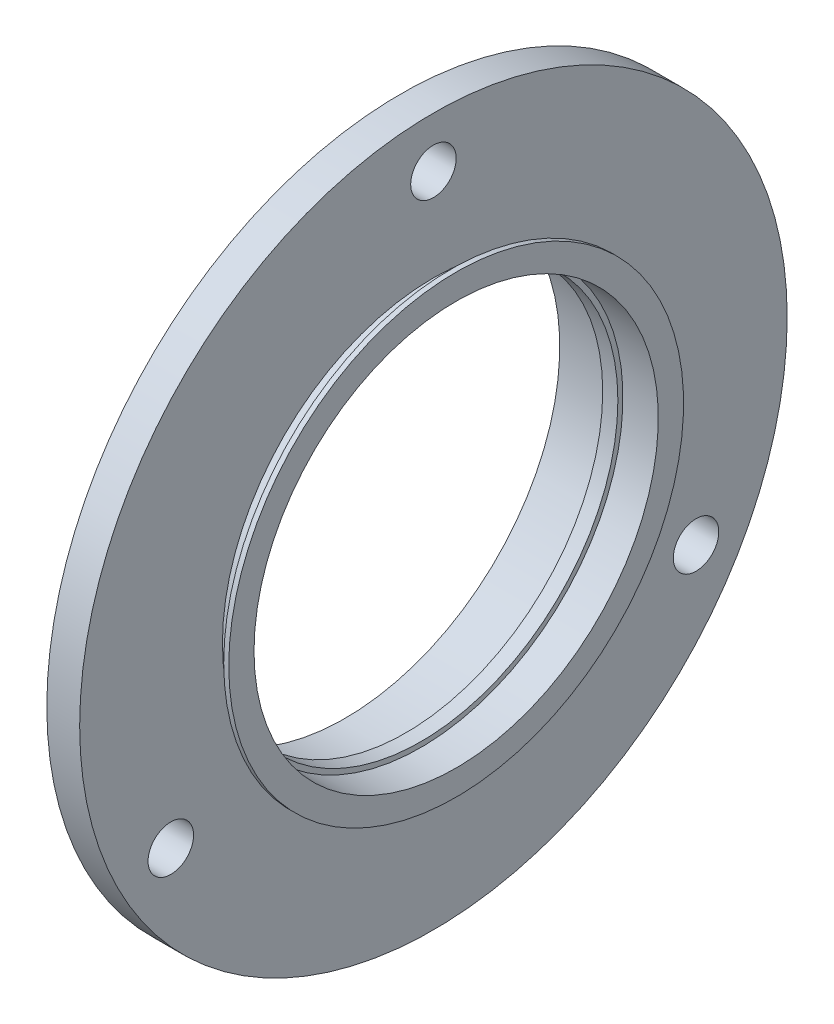
ISO-10303-21;
HEADER;
FILE_DESCRIPTION(('STEP AP214'),'2;1');
FILE_NAME('part.step','',(''),(''),'','','');
FILE_SCHEMA(('AUTOMOTIVE_DESIGN { 1 0 10303 214 1 1 1 1 }'));
ENDSEC;
DATA;
#1=APPLICATION_CONTEXT('core data for automotive mechanical design processes');
#2=APPLICATION_PROTOCOL_DEFINITION('international standard','automotive_design',2000,#1);
#3=PRODUCT_CONTEXT('',#1,'mechanical');
#4=PRODUCT('Part','Part','',(#3));
#5=PRODUCT_RELATED_PRODUCT_CATEGORY('part','',(#4));
#6=PRODUCT_DEFINITION_FORMATION('','',#4);
#7=PRODUCT_DEFINITION_CONTEXT('part definition',#1,'design');
#8=PRODUCT_DEFINITION('design','',#6,#7);
#9=PRODUCT_DEFINITION_SHAPE('','',#8);
#10=(LENGTH_UNIT() NAMED_UNIT(*) SI_UNIT(.MILLI.,.METRE.));
#11=(NAMED_UNIT(*) PLANE_ANGLE_UNIT() SI_UNIT($,.RADIAN.));
#12=(NAMED_UNIT(*) SI_UNIT($,.STERADIAN.) SOLID_ANGLE_UNIT());
#13=UNCERTAINTY_MEASURE_WITH_UNIT(LENGTH_MEASURE(1.E-05),#10,'distance_accuracy_value','');
#14=(GEOMETRIC_REPRESENTATION_CONTEXT(3) GLOBAL_UNCERTAINTY_ASSIGNED_CONTEXT((#13)) GLOBAL_UNIT_ASSIGNED_CONTEXT((#10,
#11,#12)) REPRESENTATION_CONTEXT('',''));
#15=CARTESIAN_POINT('',(0.,0.,0.));
#16=DIRECTION('',(0.,0.,1.));
#17=DIRECTION('',(1.,0.,0.));
#18=AXIS2_PLACEMENT_3D('',#15,#16,#17);
#19=CARTESIAN_POINT('',(-54.5549392406658,0.,0.));
#20=DIRECTION('',(-1.,0.,0.));
#21=DIRECTION('',(0.,0.,1.));
#22=AXIS2_PLACEMENT_3D('',#19,#20,#21);
#23=CYLINDRICAL_SURFACE('',#22,40.);
#24=CARTESIAN_POINT('',(0.,0.,0.));
#25=DIRECTION('',(-1.,0.,0.));
#26=DIRECTION('',(0.,0.,1.));
#27=AXIS2_PLACEMENT_3D('',#24,#25,#26);
#28=CIRCLE('',#27,40.);
#29=CARTESIAN_POINT('',(0.,0.,40.));
#30=VERTEX_POINT('',#29);
#31=EDGE_CURVE('E10',#30,#30,#28,.T.);
#32=ORIENTED_EDGE('',*,*,#31,.F.);
#33=EDGE_LOOP('',(#32));
#34=FACE_BOUND('',#33,.T.);
#35=CARTESIAN_POINT('',(-7.00000000000001,0.,0.));
#36=DIRECTION('',(-1.,0.,0.));
#37=DIRECTION('',(0.,0.,1.));
#38=AXIS2_PLACEMENT_3D('',#35,#36,#37);
#39=CIRCLE('',#38,40.);
#40=CARTESIAN_POINT('',(-7.00000000000001,0.,40.));
#41=VERTEX_POINT('',#40);
#42=EDGE_CURVE('E77',#41,#41,#39,.T.);
#43=ORIENTED_EDGE('',*,*,#42,.T.);
#44=EDGE_LOOP('',(#43));
#45=FACE_BOUND('',#44,.T.);
#46=ADVANCED_FACE('F31',(#34,#45),#23,.F.);
#47=CARTESIAN_POINT('',(0.,40.,0.));
#48=DIRECTION('',(-1.,0.,0.));
#49=DIRECTION('',(0.,0.,1.));
#50=AXIS2_PLACEMENT_3D('',#47,#48,#49);
#51=PLANE('',#50);
#52=CARTESIAN_POINT('',(0.,0.,0.));
#53=DIRECTION('',(-1.,0.,0.));
#54=DIRECTION('',(0.,0.,1.));
#55=AXIS2_PLACEMENT_3D('',#52,#53,#54);
#56=CIRCLE('',#55,45.);
#57=CARTESIAN_POINT('',(0.,0.,45.));
#58=VERTEX_POINT('',#57);
#59=EDGE_CURVE('E37',#58,#58,#56,.T.);
#60=ORIENTED_EDGE('',*,*,#59,.F.);
#61=EDGE_LOOP('',(#60));
#62=FACE_BOUND('',#61,.T.);
#63=ORIENTED_EDGE('',*,*,#31,.T.);
#64=EDGE_LOOP('',(#63));
#65=FACE_BOUND('',#64,.T.);
#66=ADVANCED_FACE('F142',(#62,#65),#51,.F.);
#67=CARTESIAN_POINT('',(-54.5549392406658,0.,0.));
#68=DIRECTION('',(-1.,0.,0.));
#69=DIRECTION('',(0.,0.,1.));
#70=AXIS2_PLACEMENT_3D('',#67,#68,#69);
#71=CYLINDRICAL_SURFACE('',#70,45.);
#72=CARTESIAN_POINT('',(-1.,0.,0.));
#73=DIRECTION('',(-1.,0.,0.));
#74=DIRECTION('',(0.,0.,1.));
#75=AXIS2_PLACEMENT_3D('',#72,#73,#74);
#76=CIRCLE('',#75,45.);
#77=CARTESIAN_POINT('',(-1.,0.,45.));
#78=VERTEX_POINT('',#77);
#79=EDGE_CURVE('E41',#78,#78,#76,.T.);
#80=ORIENTED_EDGE('',*,*,#79,.F.);
#81=EDGE_LOOP('',(#80));
#82=FACE_BOUND('',#81,.T.);
#83=ORIENTED_EDGE('',*,*,#59,.T.);
#84=EDGE_LOOP('',(#83));
#85=FACE_BOUND('',#84,.T.);
#86=ADVANCED_FACE('F137',(#82,#85),#71,.T.);
#87=CARTESIAN_POINT('',(-1.,41.75,0.));
#88=DIRECTION('',(1.,0.,0.));
#89=DIRECTION('',(0.,0.,-1.));
#90=AXIS2_PLACEMENT_3D('',#87,#88,#89);
#91=PLANE('',#90);
#92=CARTESIAN_POINT('',(-1.,0.,0.));
#93=DIRECTION('',(-1.,0.,0.));
#94=DIRECTION('',(0.,0.,1.));
#95=AXIS2_PLACEMENT_3D('',#92,#93,#94);
#96=CIRCLE('',#95,41.75);
#97=CARTESIAN_POINT('',(-1.,0.,41.75));
#98=VERTEX_POINT('',#97);
#99=EDGE_CURVE('E45',#98,#98,#96,.T.);
#100=ORIENTED_EDGE('',*,*,#99,.F.);
#101=EDGE_LOOP('',(#100));
#102=FACE_BOUND('',#101,.T.);
#103=ORIENTED_EDGE('',*,*,#79,.T.);
#104=EDGE_LOOP('',(#103));
#105=FACE_BOUND('',#104,.T.);
#106=ADVANCED_FACE('F131',(#102,#105),#91,.F.);
#107=CARTESIAN_POINT('',(-54.5549392406658,0.,0.));
#108=DIRECTION('',(-1.,0.,0.));
#109=DIRECTION('',(0.,0.,1.));
#110=AXIS2_PLACEMENT_3D('',#107,#108,#109);
#111=CYLINDRICAL_SURFACE('',#110,41.75);
#112=CARTESIAN_POINT('',(-4.5,0.,0.));
#113=DIRECTION('',(-1.,0.,0.));
#114=DIRECTION('',(0.,0.,1.));
#115=AXIS2_PLACEMENT_3D('',#112,#113,#114);
#116=CIRCLE('',#115,41.75);
#117=CARTESIAN_POINT('',(-4.5,0.,41.75));
#118=VERTEX_POINT('',#117);
#119=EDGE_CURVE('E50',#118,#118,#116,.T.);
#120=ORIENTED_EDGE('',*,*,#119,.F.);
#121=EDGE_LOOP('',(#120));
#122=FACE_BOUND('',#121,.T.);
#123=ORIENTED_EDGE('',*,*,#99,.T.);
#124=EDGE_LOOP('',(#123));
#125=FACE_BOUND('',#124,.T.);
#126=ADVANCED_FACE('F124',(#122,#125),#111,.T.);
#127=CARTESIAN_POINT('',(-4.5,41.75,0.));
#128=DIRECTION('',(-1.,0.,0.));
#129=DIRECTION('',(0.,0.,1.));
#130=AXIS2_PLACEMENT_3D('',#127,#128,#129);
#131=PLANE('',#130);
#132=CARTESIAN_POINT('',(-4.5,60.,0.));
#133=DIRECTION('',(-1.,0.,0.));
#134=DIRECTION('',(0.,0.,1.));
#135=AXIS2_PLACEMENT_3D('',#132,#133,#134);
#136=CIRCLE('',#135,4.5);
#137=CARTESIAN_POINT('',(-4.5,60.,4.5));
#138=VERTEX_POINT('',#137);
#139=EDGE_CURVE('E80',#138,#138,#136,.T.);
#140=ORIENTED_EDGE('',*,*,#139,.T.);
#141=EDGE_LOOP('',(#140));
#142=FACE_BOUND('',#141,.T.);
#143=CARTESIAN_POINT('',(-4.5,-29.9999999999982,51.9615242270695));
#144=DIRECTION('',(-1.,0.,0.));
#145=DIRECTION('',(0.,0.,1.));
#146=AXIS2_PLACEMENT_3D('',#143,#144,#145);
#147=CIRCLE('',#146,4.5);
#148=CARTESIAN_POINT('',(-4.5,-29.9999999999982,56.4615242270695));
#149=VERTEX_POINT('',#148);
#150=EDGE_CURVE('E83',#149,#149,#147,.T.);
#151=ORIENTED_EDGE('',*,*,#150,.T.);
#152=EDGE_LOOP('',(#151));
#153=FACE_BOUND('',#152,.T.);
#154=CARTESIAN_POINT('',(-4.5,-30.0000000000019,-51.9615242270631));
#155=DIRECTION('',(-1.,0.,0.));
#156=DIRECTION('',(0.,0.,1.));
#157=AXIS2_PLACEMENT_3D('',#154,#155,#156);
#158=CIRCLE('',#157,4.5);
#159=CARTESIAN_POINT('',(-4.5,-30.0000000000019,-47.4615242270631));
#160=VERTEX_POINT('',#159);
#161=EDGE_CURVE('E86',#160,#160,#158,.T.);
#162=ORIENTED_EDGE('',*,*,#161,.T.);
#163=EDGE_LOOP('',(#162));
#164=FACE_BOUND('',#163,.T.);
#165=CARTESIAN_POINT('',(-4.5,0.,0.));
#166=DIRECTION('',(-1.,0.,0.));
#167=DIRECTION('',(0.,0.,1.));
#168=AXIS2_PLACEMENT_3D('',#165,#166,#167);
#169=CIRCLE('',#168,70.);
#170=CARTESIAN_POINT('',(-4.5,0.,70.));
#171=VERTEX_POINT('',#170);
#172=EDGE_CURVE('E53',#171,#171,#169,.T.);
#173=ORIENTED_EDGE('',*,*,#172,.F.);
#174=EDGE_LOOP('',(#173));
#175=FACE_BOUND('',#174,.T.);
#176=ORIENTED_EDGE('',*,*,#119,.T.);
#177=EDGE_LOOP('',(#176));
#178=FACE_BOUND('',#177,.T.);
#179=ADVANCED_FACE('F118',(#142,#153,#164,#175,#178),#131,.F.);
#180=CARTESIAN_POINT('',(-54.5549392406658,0.,0.));
#181=DIRECTION('',(-1.,0.,0.));
#182=DIRECTION('',(0.,0.,1.));
#183=AXIS2_PLACEMENT_3D('',#180,#181,#182);
#184=CYLINDRICAL_SURFACE('',#183,70.);
#185=CARTESIAN_POINT('',(-11.,0.,0.));
#186=DIRECTION('',(-1.,0.,0.));
#187=DIRECTION('',(0.,0.,1.));
#188=AXIS2_PLACEMENT_3D('',#185,#186,#187);
#189=CIRCLE('',#188,70.);
#190=CARTESIAN_POINT('',(-11.,0.,70.));
#191=VERTEX_POINT('',#190);
#192=EDGE_CURVE('E56',#191,#191,#189,.T.);
#193=ORIENTED_EDGE('',*,*,#192,.F.);
#194=EDGE_LOOP('',(#193));
#195=FACE_BOUND('',#194,.T.);
#196=ORIENTED_EDGE('',*,*,#172,.T.);
#197=EDGE_LOOP('',(#196));
#198=FACE_BOUND('',#197,.T.);
#199=ADVANCED_FACE('F106',(#195,#198),#184,.T.);
#200=CARTESIAN_POINT('',(-11.,70.,0.));
#201=DIRECTION('',(1.,0.,0.));
#202=DIRECTION('',(0.,0.,-1.));
#203=AXIS2_PLACEMENT_3D('',#200,#201,#202);
#204=PLANE('',#203);
#205=CARTESIAN_POINT('',(-11.,60.,0.));
#206=DIRECTION('',(-1.,0.,0.));
#207=DIRECTION('',(0.,0.,1.));
#208=AXIS2_PLACEMENT_3D('',#205,#206,#207);
#209=CIRCLE('',#208,4.5);
#210=CARTESIAN_POINT('',(-11.,60.,4.5));
#211=VERTEX_POINT('',#210);
#212=EDGE_CURVE('E89',#211,#211,#209,.T.);
#213=ORIENTED_EDGE('',*,*,#212,.F.);
#214=EDGE_LOOP('',(#213));
#215=FACE_BOUND('',#214,.T.);
#216=CARTESIAN_POINT('',(-11.,-29.9999999999982,51.9615242270695));
#217=DIRECTION('',(-1.,0.,0.));
#218=DIRECTION('',(0.,0.,1.));
#219=AXIS2_PLACEMENT_3D('',#216,#217,#218);
#220=CIRCLE('',#219,4.5);
#221=CARTESIAN_POINT('',(-11.,-29.9999999999982,56.4615242270695));
#222=VERTEX_POINT('',#221);
#223=EDGE_CURVE('E93',#222,#222,#220,.T.);
#224=ORIENTED_EDGE('',*,*,#223,.F.);
#225=EDGE_LOOP('',(#224));
#226=FACE_BOUND('',#225,.T.);
#227=CARTESIAN_POINT('',(-11.,-30.0000000000019,-51.9615242270631));
#228=DIRECTION('',(-1.,0.,0.));
#229=DIRECTION('',(0.,0.,1.));
#230=AXIS2_PLACEMENT_3D('',#227,#228,#229);
#231=CIRCLE('',#230,4.5);
#232=CARTESIAN_POINT('',(-11.,-30.0000000000019,-47.4615242270631));
#233=VERTEX_POINT('',#232);
#234=EDGE_CURVE('E90',#233,#233,#231,.T.);
#235=ORIENTED_EDGE('',*,*,#234,.F.);
#236=EDGE_LOOP('',(#235));
#237=FACE_BOUND('',#236,.T.);
#238=CARTESIAN_POINT('',(-11.,0.,0.));
#239=DIRECTION('',(-1.,0.,0.));
#240=DIRECTION('',(0.,0.,1.));
#241=AXIS2_PLACEMENT_3D('',#238,#239,#240);
#242=CIRCLE('',#241,47.5);
#243=CARTESIAN_POINT('',(-11.,0.,47.5));
#244=VERTEX_POINT('',#243);
#245=EDGE_CURVE('E59',#244,#244,#242,.T.);
#246=ORIENTED_EDGE('',*,*,#245,.F.);
#247=EDGE_LOOP('',(#246));
#248=FACE_BOUND('',#247,.T.);
#249=ORIENTED_EDGE('',*,*,#192,.T.);
#250=EDGE_LOOP('',(#249));
#251=FACE_BOUND('',#250,.T.);
#252=ADVANCED_FACE('F102',(#215,#226,#237,#248,#251),#204,.F.);
#253=CARTESIAN_POINT('',(-54.5549392406658,0.,0.));
#254=DIRECTION('',(-1.,0.,0.));
#255=DIRECTION('',(0.,0.,1.));
#256=AXIS2_PLACEMENT_3D('',#253,#254,#255);
#257=CYLINDRICAL_SURFACE('',#256,47.5);
#258=CARTESIAN_POINT('',(-22.,0.,0.));
#259=DIRECTION('',(-1.,0.,0.));
#260=DIRECTION('',(0.,0.,1.));
#261=AXIS2_PLACEMENT_3D('',#258,#259,#260);
#262=CIRCLE('',#261,47.5);
#263=CARTESIAN_POINT('',(-22.,0.,47.5));
#264=VERTEX_POINT('',#263);
#265=EDGE_CURVE('E62',#264,#264,#262,.T.);
#266=ORIENTED_EDGE('',*,*,#265,.F.);
#267=EDGE_LOOP('',(#266));
#268=FACE_BOUND('',#267,.T.);
#269=ORIENTED_EDGE('',*,*,#245,.T.);
#270=EDGE_LOOP('',(#269));
#271=FACE_BOUND('',#270,.T.);
#272=ADVANCED_FACE('F105',(#268,#271),#257,.T.);
#273=CARTESIAN_POINT('',(-22.,47.5,0.));
#274=DIRECTION('',(1.,0.,0.));
#275=DIRECTION('',(0.,0.,-1.));
#276=AXIS2_PLACEMENT_3D('',#273,#274,#275);
#277=PLANE('',#276);
#278=CARTESIAN_POINT('',(-22.,0.,0.));
#279=DIRECTION('',(-1.,0.,0.));
#280=DIRECTION('',(0.,0.,1.));
#281=AXIS2_PLACEMENT_3D('',#278,#279,#280);
#282=CIRCLE('',#281,42.5);
#283=CARTESIAN_POINT('',(-22.,0.,42.5));
#284=VERTEX_POINT('',#283);
#285=EDGE_CURVE('E65',#284,#284,#282,.T.);
#286=ORIENTED_EDGE('',*,*,#285,.F.);
#287=EDGE_LOOP('',(#286));
#288=FACE_BOUND('',#287,.T.);
#289=ORIENTED_EDGE('',*,*,#265,.T.);
#290=EDGE_LOOP('',(#289));
#291=FACE_BOUND('',#290,.T.);
#292=ADVANCED_FACE('F177',(#288,#291),#277,.F.);
#293=CARTESIAN_POINT('',(-54.5549392406658,0.,0.));
#294=DIRECTION('',(-1.,0.,0.));
#295=DIRECTION('',(0.,0.,1.));
#296=AXIS2_PLACEMENT_3D('',#293,#294,#295);
#297=CYLINDRICAL_SURFACE('',#296,42.5);
#298=CARTESIAN_POINT('',(-10.,0.,0.));
#299=DIRECTION('',(-1.,0.,0.));
#300=DIRECTION('',(0.,0.,1.));
#301=AXIS2_PLACEMENT_3D('',#298,#299,#300);
#302=CIRCLE('',#301,42.5);
#303=CARTESIAN_POINT('',(-10.,0.,42.5));
#304=VERTEX_POINT('',#303);
#305=EDGE_CURVE('E68',#304,#304,#302,.T.);
#306=ORIENTED_EDGE('',*,*,#305,.F.);
#307=EDGE_LOOP('',(#306));
#308=FACE_BOUND('',#307,.T.);
#309=ORIENTED_EDGE('',*,*,#285,.T.);
#310=EDGE_LOOP('',(#309));
#311=FACE_BOUND('',#310,.T.);
#312=ADVANCED_FACE('F171',(#308,#311),#297,.F.);
#313=CARTESIAN_POINT('',(-10.,42.5,0.));
#314=DIRECTION('',(1.,0.,0.));
#315=DIRECTION('',(0.,0.,-1.));
#316=AXIS2_PLACEMENT_3D('',#313,#314,#315);
#317=PLANE('',#316);
#318=CARTESIAN_POINT('',(-10.,0.,0.));
#319=DIRECTION('',(-1.,0.,0.));
#320=DIRECTION('',(0.,0.,1.));
#321=AXIS2_PLACEMENT_3D('',#318,#319,#320);
#322=CIRCLE('',#321,39.);
#323=CARTESIAN_POINT('',(-10.,0.,39.));
#324=VERTEX_POINT('',#323);
#325=EDGE_CURVE('E71',#324,#324,#322,.T.);
#326=ORIENTED_EDGE('',*,*,#325,.F.);
#327=EDGE_LOOP('',(#326));
#328=FACE_BOUND('',#327,.T.);
#329=ORIENTED_EDGE('',*,*,#305,.T.);
#330=EDGE_LOOP('',(#329));
#331=FACE_BOUND('',#330,.T.);
#332=ADVANCED_FACE('F165',(#328,#331),#317,.F.);
#333=CARTESIAN_POINT('',(-54.5549392406658,0.,0.));
#334=DIRECTION('',(-1.,0.,0.));
#335=DIRECTION('',(0.,0.,1.));
#336=AXIS2_PLACEMENT_3D('',#333,#334,#335);
#337=CYLINDRICAL_SURFACE('',#336,39.);
#338=CARTESIAN_POINT('',(-7.00000000000001,0.,0.));
#339=DIRECTION('',(-1.,0.,0.));
#340=DIRECTION('',(0.,0.,1.));
#341=AXIS2_PLACEMENT_3D('',#338,#339,#340);
#342=CIRCLE('',#341,39.);
#343=CARTESIAN_POINT('',(-7.00000000000001,0.,39.));
#344=VERTEX_POINT('',#343);
#345=EDGE_CURVE('E74',#344,#344,#342,.T.);
#346=ORIENTED_EDGE('',*,*,#345,.F.);
#347=EDGE_LOOP('',(#346));
#348=FACE_BOUND('',#347,.T.);
#349=ORIENTED_EDGE('',*,*,#325,.T.);
#350=EDGE_LOOP('',(#349));
#351=FACE_BOUND('',#350,.T.);
#352=ADVANCED_FACE('F159',(#348,#351),#337,.F.);
#353=CARTESIAN_POINT('',(-7.00000000000001,39.,0.));
#354=DIRECTION('',(-1.,0.,0.));
#355=DIRECTION('',(0.,0.,1.));
#356=AXIS2_PLACEMENT_3D('',#353,#354,#355);
#357=PLANE('',#356);
#358=ORIENTED_EDGE('',*,*,#42,.F.);
#359=EDGE_LOOP('',(#358));
#360=FACE_BOUND('',#359,.T.);
#361=ORIENTED_EDGE('',*,*,#345,.T.);
#362=EDGE_LOOP('',(#361));
#363=FACE_BOUND('',#362,.T.);
#364=ADVANCED_FACE('F155',(#360,#363),#357,.F.);
#365=CARTESIAN_POINT('',(0.,-30.0000000000019,-51.9615242270631));
#366=DIRECTION('',(-1.,0.,0.));
#367=DIRECTION('',(0.,0.,1.));
#368=AXIS2_PLACEMENT_3D('',#365,#366,#367);
#369=CYLINDRICAL_SURFACE('',#368,4.5);
#370=CARTESIAN_POINT('',(-11.,-30.0000000000019,-47.4615242270631));
#371=CARTESIAN_POINT('',(-10.9322916666667,-30.0000000000019,-47.4615242270631));
#372=CARTESIAN_POINT('',(-10.8645833333334,-30.0000000000019,-47.4615242270631));
#373=CARTESIAN_POINT('',(-10.7291666666667,-30.0000000000019,-47.4615242270631));
#374=CARTESIAN_POINT('',(-10.6614583333334,-30.0000000000019,-47.4615242270631));
#375=CARTESIAN_POINT('',(-10.5260416666667,-30.0000000000019,-47.4615242270631));
#376=CARTESIAN_POINT('',(-10.4583333333334,-30.0000000000019,-47.4615242270631));
#377=CARTESIAN_POINT('',(-10.3229166666667,-30.0000000000019,-47.4615242270631));
#378=CARTESIAN_POINT('',(-10.2552083333334,-30.0000000000019,-47.4615242270631));
#379=CARTESIAN_POINT('',(-10.1197916666667,-30.0000000000019,-47.4615242270631));
#380=CARTESIAN_POINT('',(-10.0520833333334,-30.0000000000019,-47.4615242270631));
#381=CARTESIAN_POINT('',(-9.9166666666667,-30.0000000000019,-47.4615242270631));
#382=CARTESIAN_POINT('',(-9.84895833333336,-30.0000000000019,-47.4615242270631));
#383=CARTESIAN_POINT('',(-9.7135416666667,-30.0000000000019,-47.4615242270631));
#384=CARTESIAN_POINT('',(-9.64583333333336,-30.0000000000019,-47.4615242270631));
#385=CARTESIAN_POINT('',(-9.51041666666669,-30.0000000000019,-47.4615242270631));
#386=CARTESIAN_POINT('',(-9.44270833333336,-30.0000000000019,-47.4615242270631));
#387=CARTESIAN_POINT('',(-9.30729166666669,-30.0000000000019,-47.4615242270631));
#388=CARTESIAN_POINT('',(-9.23958333333336,-30.0000000000019,-47.4615242270631));
#389=CARTESIAN_POINT('',(-9.10416666666669,-30.0000000000019,-47.4615242270631));
#390=CARTESIAN_POINT('',(-9.03645833333336,-30.0000000000019,-47.4615242270631));
#391=CARTESIAN_POINT('',(-8.90104166666669,-30.0000000000019,-47.4615242270631));
#392=CARTESIAN_POINT('',(-8.83333333333336,-30.0000000000019,-47.4615242270631));
#393=CARTESIAN_POINT('',(-8.69791666666669,-30.0000000000019,-47.4615242270631));
#394=CARTESIAN_POINT('',(-8.63020833333336,-30.0000000000019,-47.4615242270631));
#395=CARTESIAN_POINT('',(-8.49479166666669,-30.0000000000019,-47.4615242270631));
#396=CARTESIAN_POINT('',(-8.42708333333336,-30.0000000000019,-47.4615242270631));
#397=CARTESIAN_POINT('',(-8.29166666666669,-30.0000000000019,-47.4615242270631));
#398=CARTESIAN_POINT('',(-8.22395833333335,-30.0000000000019,-47.4615242270631));
#399=CARTESIAN_POINT('',(-8.08854166666669,-30.0000000000019,-47.4615242270631));
#400=CARTESIAN_POINT('',(-8.02083333333335,-30.0000000000019,-47.4615242270631));
#401=CARTESIAN_POINT('',(-7.88541666666669,-30.0000000000019,-47.4615242270631));
#402=CARTESIAN_POINT('',(-7.81770833333335,-30.0000000000019,-47.4615242270631));
#403=CARTESIAN_POINT('',(-7.68229166666669,-30.0000000000019,-47.4615242270631));
#404=CARTESIAN_POINT('',(-7.61458333333335,-30.0000000000019,-47.4615242270631));
#405=CARTESIAN_POINT('',(-7.47916666666668,-30.0000000000019,-47.4615242270631));
#406=CARTESIAN_POINT('',(-7.41145833333335,-30.0000000000019,-47.4615242270631));
#407=CARTESIAN_POINT('',(-7.27604166666668,-30.0000000000019,-47.4615242270631));
#408=CARTESIAN_POINT('',(-7.20833333333335,-30.0000000000019,-47.4615242270631));
#409=CARTESIAN_POINT('',(-7.07291666666668,-30.0000000000019,-47.4615242270631));
#410=CARTESIAN_POINT('',(-7.00520833333335,-30.0000000000019,-47.4615242270631));
#411=CARTESIAN_POINT('',(-6.86979166666668,-30.0000000000019,-47.4615242270631));
#412=CARTESIAN_POINT('',(-6.80208333333335,-30.0000000000019,-47.4615242270631));
#413=CARTESIAN_POINT('',(-6.66666666666668,-30.0000000000019,-47.4615242270631));
#414=CARTESIAN_POINT('',(-6.59895833333335,-30.0000000000019,-47.4615242270631));
#415=CARTESIAN_POINT('',(-6.46354166666668,-30.0000000000019,-47.4615242270631));
#416=CARTESIAN_POINT('',(-6.39583333333335,-30.0000000000019,-47.4615242270631));
#417=CARTESIAN_POINT('',(-6.26041666666668,-30.0000000000019,-47.4615242270631));
#418=CARTESIAN_POINT('',(-6.19270833333335,-30.0000000000019,-47.4615242270631));
#419=CARTESIAN_POINT('',(-6.05729166666668,-30.0000000000019,-47.4615242270631));
#420=CARTESIAN_POINT('',(-5.98958333333334,-30.0000000000019,-47.4615242270631));
#421=CARTESIAN_POINT('',(-5.85416666666668,-30.0000000000019,-47.4615242270631));
#422=CARTESIAN_POINT('',(-5.78645833333334,-30.0000000000019,-47.4615242270631));
#423=CARTESIAN_POINT('',(-5.65104166666668,-30.0000000000019,-47.4615242270631));
#424=CARTESIAN_POINT('',(-5.58333333333334,-30.0000000000019,-47.4615242270631));
#425=CARTESIAN_POINT('',(-5.44791666666667,-30.0000000000019,-47.4615242270631));
#426=CARTESIAN_POINT('',(-5.38020833333334,-30.0000000000019,-47.4615242270631));
#427=CARTESIAN_POINT('',(-5.24479166666667,-30.0000000000019,-47.4615242270631));
#428=CARTESIAN_POINT('',(-5.17708333333334,-30.0000000000019,-47.4615242270631));
#429=CARTESIAN_POINT('',(-5.04166666666667,-30.0000000000019,-47.4615242270631));
#430=CARTESIAN_POINT('',(-4.97395833333334,-30.0000000000019,-47.4615242270631));
#431=CARTESIAN_POINT('',(-4.83854166666667,-30.0000000000019,-47.4615242270631));
#432=CARTESIAN_POINT('',(-4.77083333333334,-30.0000000000019,-47.4615242270631));
#433=CARTESIAN_POINT('',(-4.63541666666667,-30.0000000000019,-47.4615242270631));
#434=CARTESIAN_POINT('',(-4.56770833333334,-30.0000000000019,-47.4615242270631));
#435=CARTESIAN_POINT('',(-4.5,-30.0000000000019,-47.4615242270631));
#436=B_SPLINE_CURVE_WITH_KNOTS('',3,(#370,#371,#372,#373,#374,#375,#376,#377,#378,#379,#380,
#381,#382,#383,#384,#385,#386,#387,#388,#389,#390,#391,#392,#393,#394,#395,#396,#397,#398,#399,
#400,#401,#402,#403,#404,#405,#406,#407,#408,#409,#410,#411,#412,#413,#414,#415,#416,#417,#418,
#419,#420,#421,#422,#423,#424,#425,#426,#427,#428,#429,#430,#431,#432,#433,#434,#435),
.UNSPECIFIED.,.F.,.F.,(4,2,2,2,2,2,2,2,2,2,2,2,2,2,2,2,2,2,2,2,2,2,2,2,2,2,2,2,2,2,2,2,4),(0.,
0.203125000000002,0.406250000000002,0.609375000000002,0.812500000000004,1.01562500000001,
1.21875000000001,1.42187500000001,1.62500000000001,1.82812500000001,2.03125000000001,
2.23437500000001,2.43750000000001,2.64062500000001,2.84375000000001,3.04687500000001,
3.25000000000002,3.45312500000002,3.65625000000002,3.85937500000002,4.06250000000002,
4.26562500000002,4.46875000000002,4.67187500000002,4.87500000000002,5.07812500000003,
5.28125000000003,5.48437500000003,5.68750000000003,5.89062500000003,6.09375000000003,
6.29687500000003,6.50000000000003),.UNSPECIFIED.);
#437=EDGE_CURVE('BSEAM158',#233,#160,#436,.T.);
#438=ORIENTED_EDGE('',*,*,#234,.T.);
#439=ORIENTED_EDGE('',*,*,#161,.F.);
#440=ORIENTED_EDGE('',*,*,#437,.T.);
#441=ORIENTED_EDGE('',*,*,#437,.F.);
#442=EDGE_LOOP('',(#438,#440,#439,#441));
#443=FACE_BOUND('',#442,.T.);
#444=ADVANCED_FACE('F158',(#443),#369,.F.);
#445=CARTESIAN_POINT('',(0.,-29.9999999999982,51.9615242270695));
#446=DIRECTION('',(-1.,0.,0.));
#447=DIRECTION('',(0.,0.,1.));
#448=AXIS2_PLACEMENT_3D('',#445,#446,#447);
#449=CYLINDRICAL_SURFACE('',#448,4.5);
#450=CARTESIAN_POINT('',(-11.,-29.9999999999982,56.4615242270695));
#451=CARTESIAN_POINT('',(-10.9322916666667,-29.9999999999982,56.4615242270695));
#452=CARTESIAN_POINT('',(-10.8645833333334,-29.9999999999982,56.4615242270695));
#453=CARTESIAN_POINT('',(-10.7291666666667,-29.9999999999982,56.4615242270695));
#454=CARTESIAN_POINT('',(-10.6614583333334,-29.9999999999982,56.4615242270695));
#455=CARTESIAN_POINT('',(-10.5260416666667,-29.9999999999982,56.4615242270695));
#456=CARTESIAN_POINT('',(-10.4583333333334,-29.9999999999982,56.4615242270695));
#457=CARTESIAN_POINT('',(-10.3229166666667,-29.9999999999982,56.4615242270695));
#458=CARTESIAN_POINT('',(-10.2552083333334,-29.9999999999982,56.4615242270695));
#459=CARTESIAN_POINT('',(-10.1197916666667,-29.9999999999982,56.4615242270695));
#460=CARTESIAN_POINT('',(-10.0520833333334,-29.9999999999982,56.4615242270695));
#461=CARTESIAN_POINT('',(-9.9166666666667,-29.9999999999982,56.4615242270695));
#462=CARTESIAN_POINT('',(-9.84895833333336,-29.9999999999982,56.4615242270695));
#463=CARTESIAN_POINT('',(-9.7135416666667,-29.9999999999982,56.4615242270695));
#464=CARTESIAN_POINT('',(-9.64583333333336,-29.9999999999982,56.4615242270695));
#465=CARTESIAN_POINT('',(-9.51041666666669,-29.9999999999982,56.4615242270695));
#466=CARTESIAN_POINT('',(-9.44270833333336,-29.9999999999982,56.4615242270695));
#467=CARTESIAN_POINT('',(-9.30729166666669,-29.9999999999982,56.4615242270695));
#468=CARTESIAN_POINT('',(-9.23958333333336,-29.9999999999982,56.4615242270695));
#469=CARTESIAN_POINT('',(-9.10416666666669,-29.9999999999982,56.4615242270695));
#470=CARTESIAN_POINT('',(-9.03645833333336,-29.9999999999982,56.4615242270695));
#471=CARTESIAN_POINT('',(-8.90104166666669,-29.9999999999982,56.4615242270695));
#472=CARTESIAN_POINT('',(-8.83333333333336,-29.9999999999982,56.4615242270695));
#473=CARTESIAN_POINT('',(-8.69791666666669,-29.9999999999982,56.4615242270695));
#474=CARTESIAN_POINT('',(-8.63020833333336,-29.9999999999982,56.4615242270695));
#475=CARTESIAN_POINT('',(-8.49479166666669,-29.9999999999982,56.4615242270695));
#476=CARTESIAN_POINT('',(-8.42708333333336,-29.9999999999982,56.4615242270695));
#477=CARTESIAN_POINT('',(-8.29166666666669,-29.9999999999982,56.4615242270695));
#478=CARTESIAN_POINT('',(-8.22395833333335,-29.9999999999982,56.4615242270695));
#479=CARTESIAN_POINT('',(-8.08854166666669,-29.9999999999982,56.4615242270695));
#480=CARTESIAN_POINT('',(-8.02083333333335,-29.9999999999982,56.4615242270695));
#481=CARTESIAN_POINT('',(-7.88541666666669,-29.9999999999982,56.4615242270695));
#482=CARTESIAN_POINT('',(-7.81770833333335,-29.9999999999982,56.4615242270695));
#483=CARTESIAN_POINT('',(-7.68229166666669,-29.9999999999982,56.4615242270695));
#484=CARTESIAN_POINT('',(-7.61458333333335,-29.9999999999982,56.4615242270695));
#485=CARTESIAN_POINT('',(-7.47916666666668,-29.9999999999982,56.4615242270695));
#486=CARTESIAN_POINT('',(-7.41145833333335,-29.9999999999982,56.4615242270695));
#487=CARTESIAN_POINT('',(-7.27604166666668,-29.9999999999982,56.4615242270695));
#488=CARTESIAN_POINT('',(-7.20833333333335,-29.9999999999982,56.4615242270695));
#489=CARTESIAN_POINT('',(-7.07291666666668,-29.9999999999982,56.4615242270695));
#490=CARTESIAN_POINT('',(-7.00520833333335,-29.9999999999982,56.4615242270695));
#491=CARTESIAN_POINT('',(-6.86979166666668,-29.9999999999982,56.4615242270695));
#492=CARTESIAN_POINT('',(-6.80208333333335,-29.9999999999982,56.4615242270695));
#493=CARTESIAN_POINT('',(-6.66666666666668,-29.9999999999982,56.4615242270695));
#494=CARTESIAN_POINT('',(-6.59895833333335,-29.9999999999982,56.4615242270695));
#495=CARTESIAN_POINT('',(-6.46354166666668,-29.9999999999982,56.4615242270695));
#496=CARTESIAN_POINT('',(-6.39583333333335,-29.9999999999982,56.4615242270695));
#497=CARTESIAN_POINT('',(-6.26041666666668,-29.9999999999982,56.4615242270695));
#498=CARTESIAN_POINT('',(-6.19270833333335,-29.9999999999982,56.4615242270695));
#499=CARTESIAN_POINT('',(-6.05729166666668,-29.9999999999982,56.4615242270695));
#500=CARTESIAN_POINT('',(-5.98958333333334,-29.9999999999982,56.4615242270695));
#501=CARTESIAN_POINT('',(-5.85416666666668,-29.9999999999982,56.4615242270695));
#502=CARTESIAN_POINT('',(-5.78645833333334,-29.9999999999982,56.4615242270695));
#503=CARTESIAN_POINT('',(-5.65104166666668,-29.9999999999982,56.4615242270695));
#504=CARTESIAN_POINT('',(-5.58333333333334,-29.9999999999982,56.4615242270695));
#505=CARTESIAN_POINT('',(-5.44791666666667,-29.9999999999982,56.4615242270695));
#506=CARTESIAN_POINT('',(-5.38020833333334,-29.9999999999982,56.4615242270695));
#507=CARTESIAN_POINT('',(-5.24479166666667,-29.9999999999982,56.4615242270695));
#508=CARTESIAN_POINT('',(-5.17708333333334,-29.9999999999982,56.4615242270695));
#509=CARTESIAN_POINT('',(-5.04166666666667,-29.9999999999982,56.4615242270695));
#510=CARTESIAN_POINT('',(-4.97395833333334,-29.9999999999982,56.4615242270695));
#511=CARTESIAN_POINT('',(-4.83854166666667,-29.9999999999982,56.4615242270695));
#512=CARTESIAN_POINT('',(-4.77083333333334,-29.9999999999982,56.4615242270695));
#513=CARTESIAN_POINT('',(-4.63541666666667,-29.9999999999982,56.4615242270695));
#514=CARTESIAN_POINT('',(-4.56770833333334,-29.9999999999982,56.4615242270695));
#515=CARTESIAN_POINT('',(-4.5,-29.9999999999982,56.4615242270695));
#516=B_SPLINE_CURVE_WITH_KNOTS('',3,(#450,#451,#452,#453,#454,#455,#456,#457,#458,#459,#460,
#461,#462,#463,#464,#465,#466,#467,#468,#469,#470,#471,#472,#473,#474,#475,#476,#477,#478,#479,
#480,#481,#482,#483,#484,#485,#486,#487,#488,#489,#490,#491,#492,#493,#494,#495,#496,#497,#498,
#499,#500,#501,#502,#503,#504,#505,#506,#507,#508,#509,#510,#511,#512,#513,#514,#515),
.UNSPECIFIED.,.F.,.F.,(4,2,2,2,2,2,2,2,2,2,2,2,2,2,2,2,2,2,2,2,2,2,2,2,2,2,2,2,2,2,2,2,4),(0.,
0.203125000000002,0.406250000000002,0.609375000000002,0.812500000000004,1.01562500000001,
1.21875000000001,1.42187500000001,1.62500000000001,1.82812500000001,2.03125000000001,
2.23437500000001,2.43750000000001,2.64062500000001,2.84375000000001,3.04687500000001,
3.25000000000002,3.45312500000002,3.65625000000002,3.85937500000002,4.06250000000002,
4.26562500000002,4.46875000000002,4.67187500000002,4.87500000000002,5.07812500000003,
5.28125000000003,5.48437500000003,5.68750000000003,5.89062500000003,6.09375000000003,
6.29687500000003,6.50000000000003),.UNSPECIFIED.);
#517=EDGE_CURVE('BSEAM194',#222,#149,#516,.T.);
#518=ORIENTED_EDGE('',*,*,#223,.T.);
#519=ORIENTED_EDGE('',*,*,#150,.F.);
#520=ORIENTED_EDGE('',*,*,#517,.T.);
#521=ORIENTED_EDGE('',*,*,#517,.F.);
#522=EDGE_LOOP('',(#518,#520,#519,#521));
#523=FACE_BOUND('',#522,.T.);
#524=ADVANCED_FACE('F194',(#523),#449,.F.);
#525=CARTESIAN_POINT('',(0.,60.,0.));
#526=DIRECTION('',(-1.,0.,0.));
#527=DIRECTION('',(0.,0.,1.));
#528=AXIS2_PLACEMENT_3D('',#525,#526,#527);
#529=CYLINDRICAL_SURFACE('',#528,4.5);
#530=CARTESIAN_POINT('',(-11.,60.,4.5));
#531=CARTESIAN_POINT('',(-10.9322916666667,60.,4.5));
#532=CARTESIAN_POINT('',(-10.8645833333334,60.,4.5));
#533=CARTESIAN_POINT('',(-10.7291666666667,60.,4.5));
#534=CARTESIAN_POINT('',(-10.6614583333334,60.,4.5));
#535=CARTESIAN_POINT('',(-10.5260416666667,60.,4.5));
#536=CARTESIAN_POINT('',(-10.4583333333334,60.,4.5));
#537=CARTESIAN_POINT('',(-10.3229166666667,60.,4.5));
#538=CARTESIAN_POINT('',(-10.2552083333334,60.,4.5));
#539=CARTESIAN_POINT('',(-10.1197916666667,60.,4.5));
#540=CARTESIAN_POINT('',(-10.0520833333334,60.,4.5));
#541=CARTESIAN_POINT('',(-9.9166666666667,60.,4.5));
#542=CARTESIAN_POINT('',(-9.84895833333336,60.,4.5));
#543=CARTESIAN_POINT('',(-9.7135416666667,60.,4.5));
#544=CARTESIAN_POINT('',(-9.64583333333336,60.,4.5));
#545=CARTESIAN_POINT('',(-9.51041666666669,60.,4.5));
#546=CARTESIAN_POINT('',(-9.44270833333336,60.,4.5));
#547=CARTESIAN_POINT('',(-9.30729166666669,60.,4.5));
#548=CARTESIAN_POINT('',(-9.23958333333336,60.,4.5));
#549=CARTESIAN_POINT('',(-9.10416666666669,60.,4.5));
#550=CARTESIAN_POINT('',(-9.03645833333336,60.,4.5));
#551=CARTESIAN_POINT('',(-8.90104166666669,60.,4.5));
#552=CARTESIAN_POINT('',(-8.83333333333336,60.,4.5));
#553=CARTESIAN_POINT('',(-8.69791666666669,60.,4.5));
#554=CARTESIAN_POINT('',(-8.63020833333336,60.,4.5));
#555=CARTESIAN_POINT('',(-8.49479166666669,60.,4.5));
#556=CARTESIAN_POINT('',(-8.42708333333336,60.,4.5));
#557=CARTESIAN_POINT('',(-8.29166666666669,60.,4.5));
#558=CARTESIAN_POINT('',(-8.22395833333335,60.,4.5));
#559=CARTESIAN_POINT('',(-8.08854166666669,60.,4.5));
#560=CARTESIAN_POINT('',(-8.02083333333335,60.,4.5));
#561=CARTESIAN_POINT('',(-7.88541666666669,60.,4.5));
#562=CARTESIAN_POINT('',(-7.81770833333335,60.,4.5));
#563=CARTESIAN_POINT('',(-7.68229166666669,60.,4.5));
#564=CARTESIAN_POINT('',(-7.61458333333335,60.,4.5));
#565=CARTESIAN_POINT('',(-7.47916666666668,60.,4.5));
#566=CARTESIAN_POINT('',(-7.41145833333335,60.,4.5));
#567=CARTESIAN_POINT('',(-7.27604166666668,60.,4.5));
#568=CARTESIAN_POINT('',(-7.20833333333335,60.,4.5));
#569=CARTESIAN_POINT('',(-7.07291666666668,60.,4.5));
#570=CARTESIAN_POINT('',(-7.00520833333335,60.,4.5));
#571=CARTESIAN_POINT('',(-6.86979166666668,60.,4.5));
#572=CARTESIAN_POINT('',(-6.80208333333335,60.,4.5));
#573=CARTESIAN_POINT('',(-6.66666666666668,60.,4.5));
#574=CARTESIAN_POINT('',(-6.59895833333335,60.,4.5));
#575=CARTESIAN_POINT('',(-6.46354166666668,60.,4.5));
#576=CARTESIAN_POINT('',(-6.39583333333335,60.,4.5));
#577=CARTESIAN_POINT('',(-6.26041666666668,60.,4.5));
#578=CARTESIAN_POINT('',(-6.19270833333335,60.,4.5));
#579=CARTESIAN_POINT('',(-6.05729166666668,60.,4.5));
#580=CARTESIAN_POINT('',(-5.98958333333334,60.,4.5));
#581=CARTESIAN_POINT('',(-5.85416666666668,60.,4.5));
#582=CARTESIAN_POINT('',(-5.78645833333334,60.,4.5));
#583=CARTESIAN_POINT('',(-5.65104166666668,60.,4.5));
#584=CARTESIAN_POINT('',(-5.58333333333334,60.,4.5));
#585=CARTESIAN_POINT('',(-5.44791666666667,60.,4.5));
#586=CARTESIAN_POINT('',(-5.38020833333334,60.,4.5));
#587=CARTESIAN_POINT('',(-5.24479166666667,60.,4.5));
#588=CARTESIAN_POINT('',(-5.17708333333334,60.,4.5));
#589=CARTESIAN_POINT('',(-5.04166666666667,60.,4.5));
#590=CARTESIAN_POINT('',(-4.97395833333334,60.,4.5));
#591=CARTESIAN_POINT('',(-4.83854166666667,60.,4.5));
#592=CARTESIAN_POINT('',(-4.77083333333334,60.,4.5));
#593=CARTESIAN_POINT('',(-4.63541666666667,60.,4.5));
#594=CARTESIAN_POINT('',(-4.56770833333334,60.,4.5));
#595=CARTESIAN_POINT('',(-4.5,60.,4.5));
#596=B_SPLINE_CURVE_WITH_KNOTS('',3,(#530,#531,#532,#533,#534,#535,#536,#537,#538,#539,#540,
#541,#542,#543,#544,#545,#546,#547,#548,#549,#550,#551,#552,#553,#554,#555,#556,#557,#558,#559,
#560,#561,#562,#563,#564,#565,#566,#567,#568,#569,#570,#571,#572,#573,#574,#575,#576,#577,#578,
#579,#580,#581,#582,#583,#584,#585,#586,#587,#588,#589,#590,#591,#592,#593,#594,#595),
.UNSPECIFIED.,.F.,.F.,(4,2,2,2,2,2,2,2,2,2,2,2,2,2,2,2,2,2,2,2,2,2,2,2,2,2,2,2,2,2,2,2,4),(0.,
0.203125000000002,0.406250000000002,0.609375000000002,0.812500000000004,1.01562500000001,
1.21875000000001,1.42187500000001,1.62500000000001,1.82812500000001,2.03125000000001,
2.23437500000001,2.43750000000001,2.64062500000001,2.84375000000001,3.04687500000001,
3.25000000000002,3.45312500000002,3.65625000000002,3.85937500000002,4.06250000000002,
4.26562500000002,4.46875000000002,4.67187500000002,4.87500000000002,5.07812500000003,
5.28125000000003,5.48437500000003,5.68750000000003,5.89062500000003,6.09375000000003,
6.29687500000003,6.50000000000003),.UNSPECIFIED.);
#597=EDGE_CURVE('BSEAM99',#211,#138,#596,.T.);
#598=ORIENTED_EDGE('',*,*,#212,.T.);
#599=ORIENTED_EDGE('',*,*,#139,.F.);
#600=ORIENTED_EDGE('',*,*,#597,.T.);
#601=ORIENTED_EDGE('',*,*,#597,.F.);
#602=EDGE_LOOP('',(#598,#600,#599,#601));
#603=FACE_BOUND('',#602,.T.);
#604=ADVANCED_FACE('F99',(#603),#529,.F.);
#605=CLOSED_SHELL('',(#46,#66,#86,#106,#126,#179,#199,#252,#272,#292,#312,#332,#352,#364,#444,
#524,#604));
#606=MANIFOLD_SOLID_BREP('B2',#605);
#607=ADVANCED_BREP_SHAPE_REPRESENTATION('',(#18,#606),#14);
#608=SHAPE_DEFINITION_REPRESENTATION(#9,#607);
ENDSEC;
END-ISO-10303-21;
